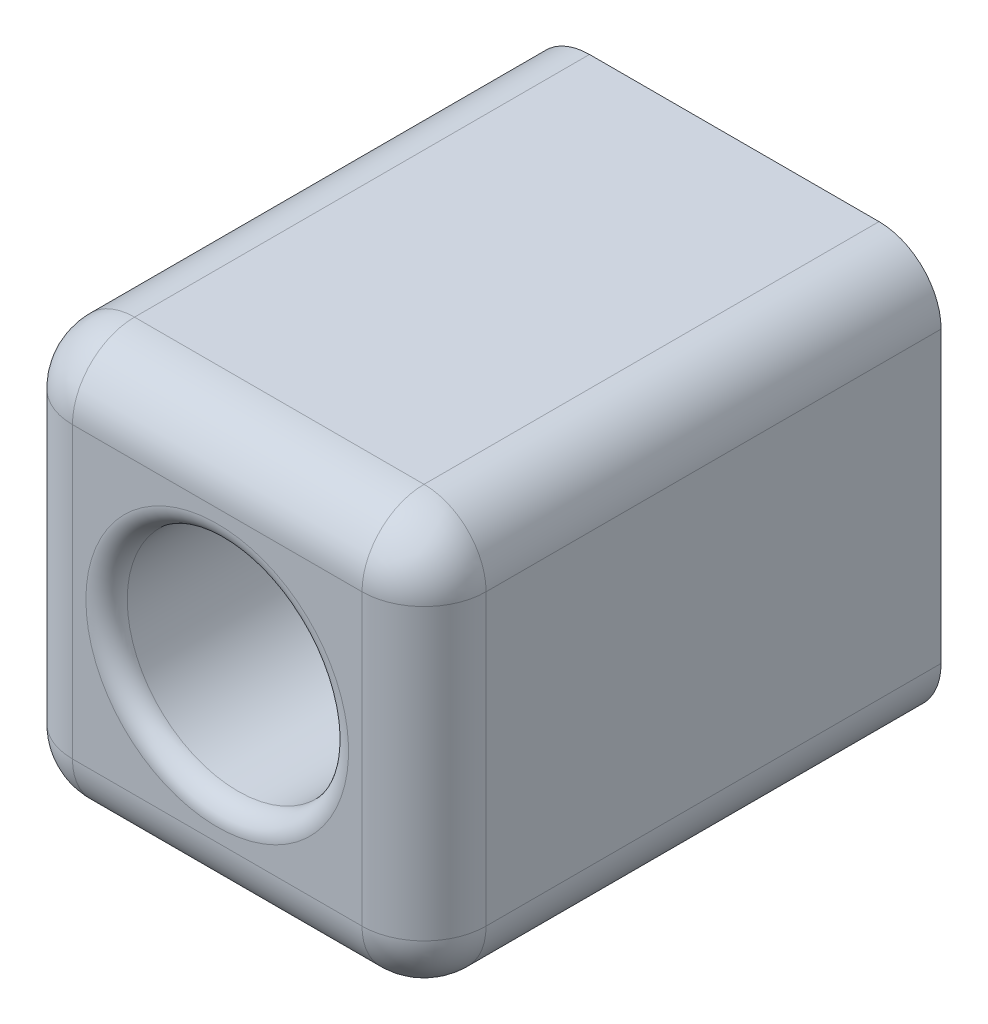
ISO-10303-21;
HEADER;
FILE_DESCRIPTION(('STEP AP214'),'2;1');
FILE_NAME('part.step','',(''),(''),'','','');
FILE_SCHEMA(('AUTOMOTIVE_DESIGN { 1 0 10303 214 1 1 1 1 }'));
ENDSEC;
DATA;
#1=APPLICATION_CONTEXT('core data for automotive mechanical design processes');
#2=APPLICATION_PROTOCOL_DEFINITION('international standard','automotive_design',2000,#1);
#3=PRODUCT_CONTEXT('',#1,'mechanical');
#4=PRODUCT('Part','Part','',(#3));
#5=PRODUCT_RELATED_PRODUCT_CATEGORY('part','',(#4));
#6=PRODUCT_DEFINITION_FORMATION('','',#4);
#7=PRODUCT_DEFINITION_CONTEXT('part definition',#1,'design');
#8=PRODUCT_DEFINITION('design','',#6,#7);
#9=PRODUCT_DEFINITION_SHAPE('','',#8);
#10=(LENGTH_UNIT() NAMED_UNIT(*) SI_UNIT(.MILLI.,.METRE.));
#11=(NAMED_UNIT(*) PLANE_ANGLE_UNIT() SI_UNIT($,.RADIAN.));
#12=(NAMED_UNIT(*) SI_UNIT($,.STERADIAN.) SOLID_ANGLE_UNIT());
#13=UNCERTAINTY_MEASURE_WITH_UNIT(LENGTH_MEASURE(1.E-05),#10,'distance_accuracy_value','');
#14=(GEOMETRIC_REPRESENTATION_CONTEXT(3) GLOBAL_UNCERTAINTY_ASSIGNED_CONTEXT((#13)) GLOBAL_UNIT_ASSIGNED_CONTEXT((#10,
#11,#12)) REPRESENTATION_CONTEXT('',''));
#15=CARTESIAN_POINT('',(0.,0.,0.));
#16=DIRECTION('',(0.,0.,1.));
#17=DIRECTION('',(1.,0.,0.));
#18=AXIS2_PLACEMENT_3D('',#15,#16,#17);
#19=CARTESIAN_POINT('',(7.,-7.,25.));
#20=DIRECTION('',(0.,0.,-1.));
#21=DIRECTION('',(-1.,0.,0.));
#22=AXIS2_PLACEMENT_3D('',#19,#20,#21);
#23=PLANE('',#22);
#24=CARTESIAN_POINT('',(0.,0.,25.));
#25=DIRECTION('',(0.,0.,-1.));
#26=DIRECTION('',(-1.,0.,0.));
#27=AXIS2_PLACEMENT_3D('',#24,#25,#26);
#28=CIRCLE('',#27,6.35);
#29=CARTESIAN_POINT('',(-6.35,0.,25.));
#30=VERTEX_POINT('',#29);
#31=EDGE_CURVE('E226',#30,#30,#28,.T.);
#32=ORIENTED_EDGE('',*,*,#31,.T.);
#33=EDGE_LOOP('',(#32));
#34=FACE_BOUND('',#33,.T.);
#35=DIRECTION('',(0.,-1.,0.));
#36=VECTOR('',#35,1.);
#37=CARTESIAN_POINT('',(-7.,-7.,25.));
#38=LINE('',#37,#36);
#39=CARTESIAN_POINT('',(-7.,7.,25.));
#40=VERTEX_POINT('',#39);
#41=CARTESIAN_POINT('',(-7.,-7.,25.));
#42=VERTEX_POINT('',#41);
#43=EDGE_CURVE('E183',#40,#42,#38,.T.);
#44=ORIENTED_EDGE('',*,*,#43,.T.);
#45=DIRECTION('',(1.,0.,0.));
#46=VECTOR('',#45,1.);
#47=CARTESIAN_POINT('',(7.,-7.,25.));
#48=LINE('',#47,#46);
#49=CARTESIAN_POINT('',(7.,-7.,25.));
#50=VERTEX_POINT('',#49);
#51=EDGE_CURVE('E185',#42,#50,#48,.T.);
#52=ORIENTED_EDGE('',*,*,#51,.T.);
#53=DIRECTION('',(0.,1.,0.));
#54=VECTOR('',#53,1.);
#55=CARTESIAN_POINT('',(7.,-7.,25.));
#56=LINE('',#55,#54);
#57=CARTESIAN_POINT('',(7.,7.,25.));
#58=VERTEX_POINT('',#57);
#59=EDGE_CURVE('E179',#50,#58,#56,.T.);
#60=ORIENTED_EDGE('',*,*,#59,.T.);
#61=DIRECTION('',(-1.,0.,0.));
#62=VECTOR('',#61,1.);
#63=CARTESIAN_POINT('',(7.,7.,25.));
#64=LINE('',#63,#62);
#65=EDGE_CURVE('E181',#58,#40,#64,.T.);
#66=ORIENTED_EDGE('',*,*,#65,.T.);
#67=EDGE_LOOP('',(#44,#52,#60,#66));
#68=FACE_BOUND('',#67,.T.);
#69=ADVANCED_FACE('F39',(#34,#68),#23,.F.);
#70=CARTESIAN_POINT('',(7.,-7.,0.));
#71=DIRECTION('',(0.,0.,-1.));
#72=DIRECTION('',(-1.,0.,0.));
#73=AXIS2_PLACEMENT_3D('',#70,#71,#72);
#74=PLANE('',#73);
#75=CARTESIAN_POINT('',(7.,-7.,0.));
#76=DIRECTION('',(0.,0.,1.));
#77=DIRECTION('',(-1.,0.,0.));
#78=AXIS2_PLACEMENT_3D('',#75,#76,#77);
#79=CIRCLE('',#78,3.);
#80=CARTESIAN_POINT('',(7.,-10.,0.));
#81=VERTEX_POINT('',#80);
#82=CARTESIAN_POINT('',(10.,-7.,0.));
#83=VERTEX_POINT('',#82);
#84=EDGE_CURVE('E136',#81,#83,#79,.T.);
#85=ORIENTED_EDGE('',*,*,#84,.F.);
#86=DIRECTION('',(1.,0.,0.));
#87=VECTOR('',#86,1.);
#88=CARTESIAN_POINT('',(-7.,-10.,0.));
#89=LINE('',#88,#87);
#90=CARTESIAN_POINT('',(-7.00000000000001,-10.,0.));
#91=VERTEX_POINT('',#90);
#92=EDGE_CURVE('E164',#91,#81,#89,.T.);
#93=ORIENTED_EDGE('',*,*,#92,.F.);
#94=CARTESIAN_POINT('',(-7.,-7.,0.));
#95=DIRECTION('',(0.,0.,1.));
#96=DIRECTION('',(1.,0.,0.));
#97=AXIS2_PLACEMENT_3D('',#94,#95,#96);
#98=CIRCLE('',#97,3.);
#99=CARTESIAN_POINT('',(-10.,-7.,0.));
#100=VERTEX_POINT('',#99);
#101=EDGE_CURVE('E161',#100,#91,#98,.T.);
#102=ORIENTED_EDGE('',*,*,#101,.F.);
#103=DIRECTION('',(0.,-1.,0.));
#104=VECTOR('',#103,1.);
#105=CARTESIAN_POINT('',(-10.,-7.,0.));
#106=LINE('',#105,#104);
#107=CARTESIAN_POINT('',(-10.,7.,0.));
#108=VERTEX_POINT('',#107);
#109=EDGE_CURVE('E158',#108,#100,#106,.T.);
#110=ORIENTED_EDGE('',*,*,#109,.F.);
#111=CARTESIAN_POINT('',(-7.,7.,0.));
#112=DIRECTION('',(0.,0.,1.));
#113=DIRECTION('',(-1.,0.,0.));
#114=AXIS2_PLACEMENT_3D('',#111,#112,#113);
#115=CIRCLE('',#114,3.);
#116=CARTESIAN_POINT('',(-7.,10.,0.));
#117=VERTEX_POINT('',#116);
#118=EDGE_CURVE('E155',#117,#108,#115,.T.);
#119=ORIENTED_EDGE('',*,*,#118,.F.);
#120=DIRECTION('',(-1.,0.,0.));
#121=VECTOR('',#120,1.);
#122=CARTESIAN_POINT('',(-7.,10.,0.));
#123=LINE('',#122,#121);
#124=CARTESIAN_POINT('',(6.99999999999998,10.,0.));
#125=VERTEX_POINT('',#124);
#126=EDGE_CURVE('E152',#125,#117,#123,.T.);
#127=ORIENTED_EDGE('',*,*,#126,.F.);
#128=CARTESIAN_POINT('',(7.,7.,0.));
#129=DIRECTION('',(0.,0.,1.));
#130=DIRECTION('',(-1.,0.,0.));
#131=AXIS2_PLACEMENT_3D('',#128,#129,#130);
#132=CIRCLE('',#131,3.);
#133=CARTESIAN_POINT('',(10.,6.99999999999998,0.));
#134=VERTEX_POINT('',#133);
#135=EDGE_CURVE('E139',#134,#125,#132,.T.);
#136=ORIENTED_EDGE('',*,*,#135,.F.);
#137=DIRECTION('',(0.,1.,0.));
#138=VECTOR('',#137,1.);
#139=CARTESIAN_POINT('',(10.,-7.,0.));
#140=LINE('',#139,#138);
#141=EDGE_CURVE('E120',#83,#134,#140,.T.);
#142=ORIENTED_EDGE('',*,*,#141,.F.);
#143=EDGE_LOOP('',(#85,#93,#102,#110,#119,#127,#136,#142));
#144=FACE_BOUND('',#143,.T.);
#145=CARTESIAN_POINT('',(0.,0.,0.));
#146=DIRECTION('',(0.,0.,1.));
#147=DIRECTION('',(1.,0.,0.));
#148=AXIS2_PLACEMENT_3D('',#145,#146,#147);
#149=CIRCLE('',#148,3.2);
#150=CARTESIAN_POINT('',(3.2,0.,0.));
#151=VERTEX_POINT('',#150);
#152=EDGE_CURVE('E145',#151,#151,#149,.T.);
#153=ORIENTED_EDGE('',*,*,#152,.T.);
#154=EDGE_LOOP('',(#153));
#155=FACE_BOUND('',#154,.T.);
#156=ADVANCED_FACE('F133',(#144,#155),#74,.T.);
#157=CARTESIAN_POINT('',(7.,-7.,25.));
#158=DIRECTION('',(0.,0.,-1.));
#159=DIRECTION('',(-1.,0.,0.));
#160=AXIS2_PLACEMENT_3D('',#157,#158,#159);
#161=CYLINDRICAL_SURFACE('',#160,3.);
#162=DIRECTION('',(0.,0.,-1.));
#163=VECTOR('',#162,1.);
#164=CARTESIAN_POINT('',(10.,-7.,25.));
#165=LINE('',#164,#163);
#166=CARTESIAN_POINT('',(10.,-7.,22.));
#167=VERTEX_POINT('',#166);
#168=EDGE_CURVE('E117',#167,#83,#165,.T.);
#169=ORIENTED_EDGE('',*,*,#168,.F.);
#170=CARTESIAN_POINT('',(7.,-7.,22.));
#171=DIRECTION('',(0.,0.,-1.));
#172=DIRECTION('',(-1.,0.,0.));
#173=AXIS2_PLACEMENT_3D('',#170,#171,#172);
#174=CIRCLE('',#173,3.);
#175=CARTESIAN_POINT('',(7.,-10.,22.));
#176=VERTEX_POINT('',#175);
#177=EDGE_CURVE('E128',#167,#176,#174,.T.);
#178=ORIENTED_EDGE('',*,*,#177,.T.);
#179=DIRECTION('',(0.,0.,-1.));
#180=VECTOR('',#179,1.);
#181=CARTESIAN_POINT('',(7.,-10.,25.));
#182=LINE('',#181,#180);
#183=EDGE_CURVE('E143',#176,#81,#182,.T.);
#184=ORIENTED_EDGE('',*,*,#183,.T.);
#185=ORIENTED_EDGE('',*,*,#84,.T.);
#186=EDGE_LOOP('',(#169,#178,#184,#185));
#187=FACE_BOUND('',#186,.T.);
#188=ADVANCED_FACE('F141',(#187),#161,.T.);
#189=CARTESIAN_POINT('',(10.,-7.,25.));
#190=DIRECTION('',(-1.,0.,0.));
#191=DIRECTION('',(0.,-1.,0.));
#192=AXIS2_PLACEMENT_3D('',#189,#190,#191);
#193=PLANE('',#192);
#194=DIRECTION('',(0.,0.,-1.));
#195=VECTOR('',#194,1.);
#196=CARTESIAN_POINT('',(10.,6.99999999999998,25.));
#197=LINE('',#196,#195);
#198=CARTESIAN_POINT('',(10.,6.99999999999998,22.));
#199=VERTEX_POINT('',#198);
#200=EDGE_CURVE('E129',#199,#134,#197,.T.);
#201=ORIENTED_EDGE('',*,*,#200,.F.);
#202=DIRECTION('',(0.,1.,0.));
#203=VECTOR('',#202,1.);
#204=CARTESIAN_POINT('',(10.,-7.,22.));
#205=LINE('',#204,#203);
#206=EDGE_CURVE('E123',#199,#167,#205,.F.);
#207=ORIENTED_EDGE('',*,*,#206,.T.);
#208=ORIENTED_EDGE('',*,*,#168,.T.);
#209=ORIENTED_EDGE('',*,*,#141,.T.);
#210=EDGE_LOOP('',(#201,#207,#208,#209));
#211=FACE_BOUND('',#210,.T.);
#212=ADVANCED_FACE('F119',(#211),#193,.F.);
#213=CARTESIAN_POINT('',(7.,7.,25.));
#214=DIRECTION('',(0.,0.,-1.));
#215=DIRECTION('',(-1.,0.,0.));
#216=AXIS2_PLACEMENT_3D('',#213,#214,#215);
#217=CYLINDRICAL_SURFACE('',#216,3.);
#218=DIRECTION('',(0.,0.,-1.));
#219=VECTOR('',#218,1.);
#220=CARTESIAN_POINT('',(6.99999999999998,10.,25.));
#221=LINE('',#220,#219);
#222=CARTESIAN_POINT('',(6.99999999999998,10.,22.));
#223=VERTEX_POINT('',#222);
#224=EDGE_CURVE('E175',#223,#125,#221,.T.);
#225=ORIENTED_EDGE('',*,*,#224,.F.);
#226=CARTESIAN_POINT('',(7.,7.,22.));
#227=DIRECTION('',(0.,0.,-1.));
#228=DIRECTION('',(-1.,0.,0.));
#229=AXIS2_PLACEMENT_3D('',#226,#227,#228);
#230=CIRCLE('',#229,3.);
#231=EDGE_CURVE('E54',#223,#199,#230,.T.);
#232=ORIENTED_EDGE('',*,*,#231,.T.);
#233=ORIENTED_EDGE('',*,*,#200,.T.);
#234=ORIENTED_EDGE('',*,*,#135,.T.);
#235=EDGE_LOOP('',(#225,#232,#233,#234));
#236=FACE_BOUND('',#235,.T.);
#237=ADVANCED_FACE('F274',(#236),#217,.T.);
#238=CARTESIAN_POINT('',(-7.,10.,25.));
#239=DIRECTION('',(0.,-1.,0.));
#240=DIRECTION('',(0.,0.,-1.));
#241=AXIS2_PLACEMENT_3D('',#238,#239,#240);
#242=PLANE('',#241);
#243=DIRECTION('',(0.,0.,-1.));
#244=VECTOR('',#243,1.);
#245=CARTESIAN_POINT('',(-7.,10.,25.));
#246=LINE('',#245,#244);
#247=CARTESIAN_POINT('',(-7.,10.,22.));
#248=VERTEX_POINT('',#247);
#249=EDGE_CURVE('E173',#248,#117,#246,.T.);
#250=ORIENTED_EDGE('',*,*,#249,.F.);
#251=DIRECTION('',(-1.,0.,0.));
#252=VECTOR('',#251,1.);
#253=CARTESIAN_POINT('',(-7.,10.,22.));
#254=LINE('',#253,#252);
#255=EDGE_CURVE('E62',#248,#223,#254,.F.);
#256=ORIENTED_EDGE('',*,*,#255,.T.);
#257=ORIENTED_EDGE('',*,*,#224,.T.);
#258=ORIENTED_EDGE('',*,*,#126,.T.);
#259=EDGE_LOOP('',(#250,#256,#257,#258));
#260=FACE_BOUND('',#259,.T.);
#261=ADVANCED_FACE('F270',(#260),#242,.F.);
#262=CARTESIAN_POINT('',(-7.,7.,25.));
#263=DIRECTION('',(0.,0.,-1.));
#264=DIRECTION('',(-1.,0.,0.));
#265=AXIS2_PLACEMENT_3D('',#262,#263,#264);
#266=CYLINDRICAL_SURFACE('',#265,3.);
#267=DIRECTION('',(0.,0.,-1.));
#268=VECTOR('',#267,1.);
#269=CARTESIAN_POINT('',(-10.,7.,25.));
#270=LINE('',#269,#268);
#271=CARTESIAN_POINT('',(-10.,7.,22.));
#272=VERTEX_POINT('',#271);
#273=EDGE_CURVE('E171',#272,#108,#270,.T.);
#274=ORIENTED_EDGE('',*,*,#273,.F.);
#275=CARTESIAN_POINT('',(-7.,7.,22.));
#276=DIRECTION('',(0.,0.,-1.));
#277=DIRECTION('',(-1.,0.,0.));
#278=AXIS2_PLACEMENT_3D('',#275,#276,#277);
#279=CIRCLE('',#278,3.);
#280=EDGE_CURVE('E194',#272,#248,#279,.T.);
#281=ORIENTED_EDGE('',*,*,#280,.T.);
#282=ORIENTED_EDGE('',*,*,#249,.T.);
#283=ORIENTED_EDGE('',*,*,#118,.T.);
#284=EDGE_LOOP('',(#274,#281,#282,#283));
#285=FACE_BOUND('',#284,.T.);
#286=ADVANCED_FACE('F266',(#285),#266,.T.);
#287=CARTESIAN_POINT('',(-10.,-7.,25.));
#288=DIRECTION('',(1.,0.,0.));
#289=DIRECTION('',(0.,0.,-1.));
#290=AXIS2_PLACEMENT_3D('',#287,#288,#289);
#291=PLANE('',#290);
#292=DIRECTION('',(0.,0.,-1.));
#293=VECTOR('',#292,1.);
#294=CARTESIAN_POINT('',(-10.,-7.,25.));
#295=LINE('',#294,#293);
#296=CARTESIAN_POINT('',(-10.,-7.,22.));
#297=VERTEX_POINT('',#296);
#298=EDGE_CURVE('E169',#297,#100,#295,.T.);
#299=ORIENTED_EDGE('',*,*,#298,.F.);
#300=DIRECTION('',(0.,-1.,0.));
#301=VECTOR('',#300,1.);
#302=CARTESIAN_POINT('',(-10.,-7.,22.));
#303=LINE('',#302,#301);
#304=EDGE_CURVE('E192',#297,#272,#303,.F.);
#305=ORIENTED_EDGE('',*,*,#304,.T.);
#306=ORIENTED_EDGE('',*,*,#273,.T.);
#307=ORIENTED_EDGE('',*,*,#109,.T.);
#308=EDGE_LOOP('',(#299,#305,#306,#307));
#309=FACE_BOUND('',#308,.T.);
#310=ADVANCED_FACE('F262',(#309),#291,.F.);
#311=CARTESIAN_POINT('',(-7.,-7.,25.));
#312=DIRECTION('',(0.,0.,-1.));
#313=DIRECTION('',(-1.,0.,0.));
#314=AXIS2_PLACEMENT_3D('',#311,#312,#313);
#315=CYLINDRICAL_SURFACE('',#314,3.);
#316=DIRECTION('',(0.,0.,-1.));
#317=VECTOR('',#316,1.);
#318=CARTESIAN_POINT('',(-7.00000000000001,-10.,25.));
#319=LINE('',#318,#317);
#320=CARTESIAN_POINT('',(-7.00000000000001,-10.,22.));
#321=VERTEX_POINT('',#320);
#322=EDGE_CURVE('E167',#321,#91,#319,.T.);
#323=ORIENTED_EDGE('',*,*,#322,.F.);
#324=CARTESIAN_POINT('',(-7.,-7.,22.));
#325=DIRECTION('',(0.,0.,-1.));
#326=DIRECTION('',(-1.,0.,0.));
#327=AXIS2_PLACEMENT_3D('',#324,#325,#326);
#328=CIRCLE('',#327,3.);
#329=EDGE_CURVE('E190',#321,#297,#328,.T.);
#330=ORIENTED_EDGE('',*,*,#329,.T.);
#331=ORIENTED_EDGE('',*,*,#298,.T.);
#332=ORIENTED_EDGE('',*,*,#101,.T.);
#333=EDGE_LOOP('',(#323,#330,#331,#332));
#334=FACE_BOUND('',#333,.T.);
#335=ADVANCED_FACE('F258',(#334),#315,.T.);
#336=CARTESIAN_POINT('',(-7.,-10.,25.));
#337=DIRECTION('',(0.,1.,0.));
#338=DIRECTION('',(-1.,0.,0.));
#339=AXIS2_PLACEMENT_3D('',#336,#337,#338);
#340=PLANE('',#339);
#341=ORIENTED_EDGE('',*,*,#183,.F.);
#342=DIRECTION('',(1.,0.,0.));
#343=VECTOR('',#342,1.);
#344=CARTESIAN_POINT('',(-7.,-10.,22.));
#345=LINE('',#344,#343);
#346=EDGE_CURVE('E188',#176,#321,#345,.F.);
#347=ORIENTED_EDGE('',*,*,#346,.T.);
#348=ORIENTED_EDGE('',*,*,#322,.T.);
#349=ORIENTED_EDGE('',*,*,#92,.T.);
#350=EDGE_LOOP('',(#341,#347,#348,#349));
#351=FACE_BOUND('',#350,.T.);
#352=ADVANCED_FACE('F255',(#351),#340,.F.);
#353=CARTESIAN_POINT('',(0.,0.,25.));
#354=DIRECTION('',(0.,0.,-1.));
#355=DIRECTION('',(-1.,0.,0.));
#356=AXIS2_PLACEMENT_3D('',#353,#354,#355);
#357=CYLINDRICAL_SURFACE('',#356,3.2);
#358=CARTESIAN_POINT('',(0.,0.,5.5));
#359=DIRECTION('',(0.,0.,-1.));
#360=DIRECTION('',(-1.,0.,0.));
#361=AXIS2_PLACEMENT_3D('',#358,#359,#360);
#362=CIRCLE('',#361,3.2);
#363=CARTESIAN_POINT('',(-3.2,0.,5.5));
#364=VERTEX_POINT('',#363);
#365=EDGE_CURVE('E203',#364,#364,#362,.T.);
#366=ORIENTED_EDGE('',*,*,#365,.F.);
#367=EDGE_LOOP('',(#366));
#368=FACE_BOUND('',#367,.T.);
#369=ORIENTED_EDGE('',*,*,#152,.F.);
#370=EDGE_LOOP('',(#369));
#371=FACE_BOUND('',#370,.T.);
#372=ADVANCED_FACE('F252',(#368,#371),#357,.F.);
#373=CARTESIAN_POINT('',(-7.,7.,22.));
#374=DIRECTION('',(0.,0.,-1.));
#375=DIRECTION('',(-1.,0.,0.));
#376=AXIS2_PLACEMENT_3D('',#373,#374,#375);
#377=SPHERICAL_SURFACE('',#376,3.);
#378=CARTESIAN_POINT('',(-7.,7.,22.));
#379=DIRECTION('',(1.,0.,0.));
#380=DIRECTION('',(0.,1.,0.));
#381=AXIS2_PLACEMENT_3D('',#378,#379,#380);
#382=CIRCLE('',#381,3.);
#383=EDGE_CURVE('E217',#248,#40,#382,.T.);
#384=ORIENTED_EDGE('',*,*,#383,.F.);
#385=ORIENTED_EDGE('',*,*,#280,.F.);
#386=CARTESIAN_POINT('',(-7.,7.,22.));
#387=DIRECTION('',(0.,-1.,0.));
#388=DIRECTION('',(0.,0.,-1.));
#389=AXIS2_PLACEMENT_3D('',#386,#387,#388);
#390=CIRCLE('',#389,3.);
#391=EDGE_CURVE('E148',#40,#272,#390,.T.);
#392=ORIENTED_EDGE('',*,*,#391,.F.);
#393=EDGE_LOOP('',(#384,#385,#392));
#394=FACE_BOUND('',#393,.T.);
#395=ADVANCED_FACE('F308',(#394),#377,.T.);
#396=CARTESIAN_POINT('',(-7.,-7.,22.));
#397=DIRECTION('',(0.,-1.,0.));
#398=DIRECTION('',(0.,0.,-1.));
#399=AXIS2_PLACEMENT_3D('',#396,#397,#398);
#400=CYLINDRICAL_SURFACE('',#399,3.);
#401=ORIENTED_EDGE('',*,*,#391,.T.);
#402=ORIENTED_EDGE('',*,*,#304,.F.);
#403=CARTESIAN_POINT('',(-7.,-7.,22.));
#404=DIRECTION('',(0.,-1.,0.));
#405=DIRECTION('',(0.,0.,-1.));
#406=AXIS2_PLACEMENT_3D('',#403,#404,#405);
#407=CIRCLE('',#406,3.);
#408=EDGE_CURVE('E214',#42,#297,#407,.T.);
#409=ORIENTED_EDGE('',*,*,#408,.F.);
#410=ORIENTED_EDGE('',*,*,#43,.F.);
#411=EDGE_LOOP('',(#401,#402,#409,#410));
#412=FACE_BOUND('',#411,.T.);
#413=ADVANCED_FACE('F304',(#412),#400,.T.);
#414=CARTESIAN_POINT('',(7.,7.,22.));
#415=DIRECTION('',(-1.,0.,0.));
#416=DIRECTION('',(0.,0.,1.));
#417=AXIS2_PLACEMENT_3D('',#414,#415,#416);
#418=CYLINDRICAL_SURFACE('',#417,3.);
#419=ORIENTED_EDGE('',*,*,#383,.T.);
#420=ORIENTED_EDGE('',*,*,#65,.F.);
#421=CARTESIAN_POINT('',(6.99999999999998,7.,22.));
#422=DIRECTION('',(1.,0.,0.));
#423=DIRECTION('',(0.,0.,-1.));
#424=AXIS2_PLACEMENT_3D('',#421,#422,#423);
#425=CIRCLE('',#424,3.);
#426=EDGE_CURVE('E211',#223,#58,#425,.T.);
#427=ORIENTED_EDGE('',*,*,#426,.F.);
#428=ORIENTED_EDGE('',*,*,#255,.F.);
#429=EDGE_LOOP('',(#419,#420,#427,#428));
#430=FACE_BOUND('',#429,.T.);
#431=ADVANCED_FACE('F300',(#430),#418,.T.);
#432=CARTESIAN_POINT('',(-7.,-7.,22.));
#433=DIRECTION('',(0.,0.,-1.));
#434=DIRECTION('',(-1.,0.,0.));
#435=AXIS2_PLACEMENT_3D('',#432,#433,#434);
#436=SPHERICAL_SURFACE('',#435,3.);
#437=ORIENTED_EDGE('',*,*,#408,.T.);
#438=ORIENTED_EDGE('',*,*,#329,.F.);
#439=CARTESIAN_POINT('',(-7.,-7.,22.));
#440=DIRECTION('',(1.,0.,0.));
#441=DIRECTION('',(0.,1.,0.));
#442=AXIS2_PLACEMENT_3D('',#439,#440,#441);
#443=CIRCLE('',#442,3.);
#444=EDGE_CURVE('E208',#42,#321,#443,.T.);
#445=ORIENTED_EDGE('',*,*,#444,.F.);
#446=EDGE_LOOP('',(#437,#438,#445));
#447=FACE_BOUND('',#446,.T.);
#448=ADVANCED_FACE('F296',(#447),#436,.T.);
#449=CARTESIAN_POINT('',(7.,7.,22.));
#450=DIRECTION('',(0.,0.,-1.));
#451=DIRECTION('',(-1.,0.,0.));
#452=AXIS2_PLACEMENT_3D('',#449,#450,#451);
#453=SPHERICAL_SURFACE('',#452,3.);
#454=ORIENTED_EDGE('',*,*,#231,.F.);
#455=ORIENTED_EDGE('',*,*,#426,.T.);
#456=CARTESIAN_POINT('',(7.,7.,22.));
#457=DIRECTION('',(0.,-1.,0.));
#458=DIRECTION('',(1.,0.,0.));
#459=AXIS2_PLACEMENT_3D('',#456,#457,#458);
#460=CIRCLE('',#459,3.);
#461=EDGE_CURVE('E205',#199,#58,#460,.T.);
#462=ORIENTED_EDGE('',*,*,#461,.F.);
#463=EDGE_LOOP('',(#454,#455,#462));
#464=FACE_BOUND('',#463,.T.);
#465=ADVANCED_FACE('F292',(#464),#453,.T.);
#466=CARTESIAN_POINT('',(7.,-7.,22.));
#467=DIRECTION('',(1.,0.,0.));
#468=DIRECTION('',(0.,1.,0.));
#469=AXIS2_PLACEMENT_3D('',#466,#467,#468);
#470=CYLINDRICAL_SURFACE('',#469,3.);
#471=ORIENTED_EDGE('',*,*,#444,.T.);
#472=ORIENTED_EDGE('',*,*,#346,.F.);
#473=CARTESIAN_POINT('',(7.,-7.,22.));
#474=DIRECTION('',(1.,0.,0.));
#475=DIRECTION('',(0.,0.,-1.));
#476=AXIS2_PLACEMENT_3D('',#473,#474,#475);
#477=CIRCLE('',#476,3.);
#478=EDGE_CURVE('E202',#50,#176,#477,.T.);
#479=ORIENTED_EDGE('',*,*,#478,.F.);
#480=ORIENTED_EDGE('',*,*,#51,.F.);
#481=EDGE_LOOP('',(#471,#472,#479,#480));
#482=FACE_BOUND('',#481,.T.);
#483=ADVANCED_FACE('F288',(#482),#470,.T.);
#484=CARTESIAN_POINT('',(7.,-7.,22.));
#485=DIRECTION('',(0.,1.,0.));
#486=DIRECTION('',(-1.,0.,0.));
#487=AXIS2_PLACEMENT_3D('',#484,#485,#486);
#488=CYLINDRICAL_SURFACE('',#487,3.);
#489=ORIENTED_EDGE('',*,*,#461,.T.);
#490=ORIENTED_EDGE('',*,*,#59,.F.);
#491=CARTESIAN_POINT('',(7.,-7.,22.));
#492=DIRECTION('',(0.,-1.,0.));
#493=DIRECTION('',(0.,0.,-1.));
#494=AXIS2_PLACEMENT_3D('',#491,#492,#493);
#495=CIRCLE('',#494,3.);
#496=EDGE_CURVE('E200',#167,#50,#495,.T.);
#497=ORIENTED_EDGE('',*,*,#496,.F.);
#498=ORIENTED_EDGE('',*,*,#206,.F.);
#499=EDGE_LOOP('',(#489,#490,#497,#498));
#500=FACE_BOUND('',#499,.T.);
#501=ADVANCED_FACE('F284',(#500),#488,.T.);
#502=CARTESIAN_POINT('',(7.,-7.,22.));
#503=DIRECTION('',(0.,0.,-1.));
#504=DIRECTION('',(-1.,0.,0.));
#505=AXIS2_PLACEMENT_3D('',#502,#503,#504);
#506=SPHERICAL_SURFACE('',#505,3.);
#507=ORIENTED_EDGE('',*,*,#478,.T.);
#508=ORIENTED_EDGE('',*,*,#177,.F.);
#509=ORIENTED_EDGE('',*,*,#496,.T.);
#510=EDGE_LOOP('',(#507,#508,#509));
#511=FACE_BOUND('',#510,.T.);
#512=ADVANCED_FACE('F281',(#511),#506,.T.);
#513=CARTESIAN_POINT('',(7.,-7.,5.5));
#514=DIRECTION('',(0.,0.,-1.));
#515=DIRECTION('',(-1.,0.,0.));
#516=AXIS2_PLACEMENT_3D('',#513,#514,#515);
#517=PLANE('',#516);
#518=CARTESIAN_POINT('',(0.,0.,5.5));
#519=DIRECTION('',(0.,0.,-1.));
#520=DIRECTION('',(-1.,0.,0.));
#521=AXIS2_PLACEMENT_3D('',#518,#519,#520);
#522=CIRCLE('',#521,4.35);
#523=CARTESIAN_POINT('',(-4.35,0.,5.5));
#524=VERTEX_POINT('',#523);
#525=EDGE_CURVE('E47',#524,#524,#522,.F.);
#526=ORIENTED_EDGE('',*,*,#525,.T.);
#527=EDGE_LOOP('',(#526));
#528=FACE_BOUND('',#527,.T.);
#529=ORIENTED_EDGE('',*,*,#365,.T.);
#530=EDGE_LOOP('',(#529));
#531=FACE_BOUND('',#530,.T.);
#532=ADVANCED_FACE('F231',(#528,#531),#517,.F.);
#533=CARTESIAN_POINT('',(0.,0.,-15.1320851173921));
#534=DIRECTION('',(0.,0.,1.));
#535=DIRECTION('',(1.,0.,0.));
#536=AXIS2_PLACEMENT_3D('',#533,#534,#535);
#537=CYLINDRICAL_SURFACE('',#536,5.35);
#538=CARTESIAN_POINT('',(0.,0.,6.5));
#539=DIRECTION('',(0.,0.,-1.));
#540=DIRECTION('',(-1.,0.,0.));
#541=AXIS2_PLACEMENT_3D('',#538,#539,#540);
#542=CIRCLE('',#541,5.35);
#543=CARTESIAN_POINT('',(-5.35,0.,6.5));
#544=VERTEX_POINT('',#543);
#545=EDGE_CURVE('E12',#544,#544,#542,.T.);
#546=ORIENTED_EDGE('',*,*,#545,.T.);
#547=EDGE_LOOP('',(#546));
#548=FACE_BOUND('',#547,.T.);
#549=CARTESIAN_POINT('',(0.,0.,24.));
#550=DIRECTION('',(0.,0.,-1.));
#551=DIRECTION('',(-1.,0.,0.));
#552=AXIS2_PLACEMENT_3D('',#549,#550,#551);
#553=CIRCLE('',#552,5.35);
#554=CARTESIAN_POINT('',(-5.35,0.,24.));
#555=VERTEX_POINT('',#554);
#556=EDGE_CURVE('E199',#555,#555,#553,.F.);
#557=ORIENTED_EDGE('',*,*,#556,.T.);
#558=EDGE_LOOP('',(#557));
#559=FACE_BOUND('',#558,.T.);
#560=ADVANCED_FACE('F240',(#548,#559),#537,.F.);
#561=CARTESIAN_POINT('',(0.,0.,24.));
#562=DIRECTION('',(0.,0.,-1.));
#563=DIRECTION('',(-1.,0.,0.));
#564=AXIS2_PLACEMENT_3D('',#561,#562,#563);
#565=TOROIDAL_SURFACE('',#564,6.35,1.);
#566=ORIENTED_EDGE('',*,*,#31,.F.);
#567=EDGE_LOOP('',(#566));
#568=FACE_BOUND('',#567,.T.);
#569=ORIENTED_EDGE('',*,*,#556,.F.);
#570=EDGE_LOOP('',(#569));
#571=FACE_BOUND('',#570,.T.);
#572=ADVANCED_FACE('F235',(#568,#571),#565,.T.);
#573=CARTESIAN_POINT('',(0.,0.,6.5));
#574=DIRECTION('',(0.,0.,-1.));
#575=DIRECTION('',(-1.,0.,0.));
#576=AXIS2_PLACEMENT_3D('',#573,#574,#575);
#577=TOROIDAL_SURFACE('',#576,4.35,1.);
#578=ORIENTED_EDGE('',*,*,#545,.F.);
#579=EDGE_LOOP('',(#578));
#580=FACE_BOUND('',#579,.T.);
#581=ORIENTED_EDGE('',*,*,#525,.F.);
#582=EDGE_LOOP('',(#581));
#583=FACE_BOUND('',#582,.T.);
#584=ADVANCED_FACE('F41',(#580,#583),#577,.F.);
#585=CLOSED_SHELL('',(#69,#156,#188,#212,#237,#261,#286,#310,#335,#352,#372,#395,#413,#431,#448,
#465,#483,#501,#512,#532,#560,#572,#584));
#586=MANIFOLD_SOLID_BREP('B2',#585);
#587=ADVANCED_BREP_SHAPE_REPRESENTATION('',(#18,#586),#14);
#588=SHAPE_DEFINITION_REPRESENTATION(#9,#587);
ENDSEC;
END-ISO-10303-21;
